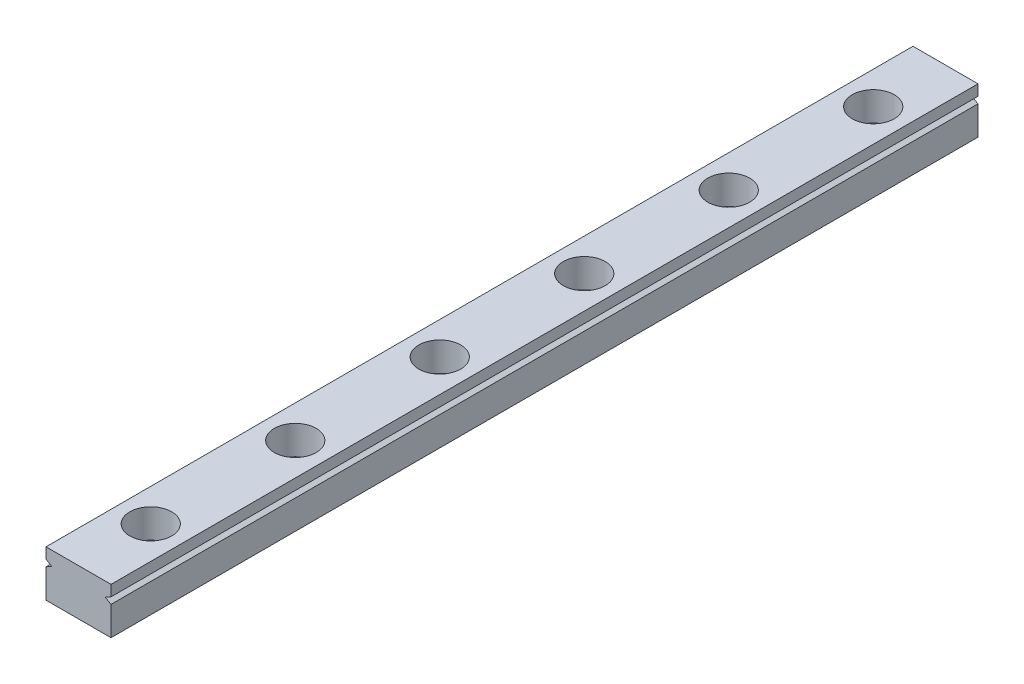
ISO-10303-21;
HEADER;
FILE_DESCRIPTION(('STEP AP214'),'2;1');
FILE_NAME('part.step','',(''),(''),'','','');
FILE_SCHEMA(('AUTOMOTIVE_DESIGN { 1 0 10303 214 1 1 1 1 }'));
ENDSEC;
DATA;
#1=APPLICATION_CONTEXT('core data for automotive mechanical design processes');
#2=APPLICATION_PROTOCOL_DEFINITION('international standard','automotive_design',2000,#1);
#3=PRODUCT_CONTEXT('',#1,'mechanical');
#4=PRODUCT('Part','Part','',(#3));
#5=PRODUCT_RELATED_PRODUCT_CATEGORY('part','',(#4));
#6=PRODUCT_DEFINITION_FORMATION('','',#4);
#7=PRODUCT_DEFINITION_CONTEXT('part definition',#1,'design');
#8=PRODUCT_DEFINITION('design','',#6,#7);
#9=PRODUCT_DEFINITION_SHAPE('','',#8);
#10=(LENGTH_UNIT() NAMED_UNIT(*) SI_UNIT(.MILLI.,.METRE.));
#11=(NAMED_UNIT(*) PLANE_ANGLE_UNIT() SI_UNIT($,.RADIAN.));
#12=(NAMED_UNIT(*) SI_UNIT($,.STERADIAN.) SOLID_ANGLE_UNIT());
#13=UNCERTAINTY_MEASURE_WITH_UNIT(LENGTH_MEASURE(1.E-05),#10,'distance_accuracy_value','');
#14=(GEOMETRIC_REPRESENTATION_CONTEXT(3) GLOBAL_UNCERTAINTY_ASSIGNED_CONTEXT((#13)) GLOBAL_UNIT_ASSIGNED_CONTEXT((#10,
#11,#12)) REPRESENTATION_CONTEXT('',''));
#15=CARTESIAN_POINT('',(0.,0.,0.));
#16=DIRECTION('',(0.,0.,1.));
#17=DIRECTION('',(1.,0.,0.));
#18=AXIS2_PLACEMENT_3D('',#15,#16,#17);
#19=CARTESIAN_POINT('',(0.,4.,120.));
#20=DIRECTION('',(1.,0.,0.));
#21=DIRECTION('',(0.,0.,-1.));
#22=AXIS2_PLACEMENT_3D('',#19,#20,#21);
#23=PLANE('',#22);
#24=DIRECTION('',(0.,-1.,0.));
#25=VECTOR('',#24,1.);
#26=CARTESIAN_POINT('',(0.,4.,0.));
#27=LINE('',#26,#25);
#28=CARTESIAN_POINT('',(0.,4.,0.));
#29=VERTEX_POINT('',#28);
#30=CARTESIAN_POINT('',(0.,0.,0.));
#31=VERTEX_POINT('',#30);
#32=EDGE_CURVE('E141',#29,#31,#27,.T.);
#33=ORIENTED_EDGE('',*,*,#32,.T.);
#34=DIRECTION('',(0.,0.,-1.));
#35=VECTOR('',#34,1.);
#36=CARTESIAN_POINT('',(0.,0.,120.));
#37=LINE('',#36,#35);
#38=CARTESIAN_POINT('',(0.,0.,120.));
#39=VERTEX_POINT('',#38);
#40=EDGE_CURVE('E11',#39,#31,#37,.T.);
#41=ORIENTED_EDGE('',*,*,#40,.F.);
#42=DIRECTION('',(0.,-1.,0.));
#43=VECTOR('',#42,1.);
#44=CARTESIAN_POINT('',(0.,4.,120.));
#45=LINE('',#44,#43);
#46=CARTESIAN_POINT('',(0.,4.,120.));
#47=VERTEX_POINT('',#46);
#48=EDGE_CURVE('E160',#47,#39,#45,.T.);
#49=ORIENTED_EDGE('',*,*,#48,.F.);
#50=DIRECTION('',(0.,0.,-1.));
#51=VECTOR('',#50,1.);
#52=CARTESIAN_POINT('',(0.,4.,120.));
#53=LINE('',#52,#51);
#54=EDGE_CURVE('E137',#47,#29,#53,.T.);
#55=ORIENTED_EDGE('',*,*,#54,.T.);
#56=EDGE_LOOP('',(#33,#41,#49,#55));
#57=FACE_BOUND('',#56,.T.);
#58=ADVANCED_FACE('F33',(#57),#23,.F.);
#59=CARTESIAN_POINT('',(0.,0.,120.));
#60=DIRECTION('',(0.,1.,0.));
#61=DIRECTION('',(0.,0.,1.));
#62=AXIS2_PLACEMENT_3D('',#59,#60,#61);
#63=PLANE('',#62);
#64=CARTESIAN_POINT('',(4.5,0.,110.));
#65=DIRECTION('',(0.,1.,0.));
#66=DIRECTION('',(0.,0.,1.));
#67=AXIS2_PLACEMENT_3D('',#64,#65,#66);
#68=CIRCLE('',#67,1.7);
#69=CARTESIAN_POINT('',(4.5,0.,111.7));
#70=VERTEX_POINT('',#69);
#71=EDGE_CURVE('E211',#70,#70,#68,.T.);
#72=ORIENTED_EDGE('',*,*,#71,.T.);
#73=EDGE_LOOP('',(#72));
#74=FACE_BOUND('',#73,.T.);
#75=CARTESIAN_POINT('',(4.49999999999993,0.,90.));
#76=DIRECTION('',(0.,1.,0.));
#77=DIRECTION('',(0.,0.,1.));
#78=AXIS2_PLACEMENT_3D('',#75,#76,#77);
#79=CIRCLE('',#78,1.7);
#80=CARTESIAN_POINT('',(4.49999999999993,0.,91.7));
#81=VERTEX_POINT('',#80);
#82=EDGE_CURVE('E270',#81,#81,#79,.T.);
#83=ORIENTED_EDGE('',*,*,#82,.T.);
#84=EDGE_LOOP('',(#83));
#85=FACE_BOUND('',#84,.T.);
#86=CARTESIAN_POINT('',(4.49999999999986,0.,70.));
#87=DIRECTION('',(0.,1.,0.));
#88=DIRECTION('',(0.,0.,1.));
#89=AXIS2_PLACEMENT_3D('',#86,#87,#88);
#90=CIRCLE('',#89,1.7);
#91=CARTESIAN_POINT('',(4.49999999999986,0.,71.7));
#92=VERTEX_POINT('',#91);
#93=EDGE_CURVE('E264',#92,#92,#90,.T.);
#94=ORIENTED_EDGE('',*,*,#93,.T.);
#95=EDGE_LOOP('',(#94));
#96=FACE_BOUND('',#95,.T.);
#97=CARTESIAN_POINT('',(4.49999999999979,0.,50.));
#98=DIRECTION('',(0.,1.,0.));
#99=DIRECTION('',(0.,0.,1.));
#100=AXIS2_PLACEMENT_3D('',#97,#98,#99);
#101=CIRCLE('',#100,1.7);
#102=CARTESIAN_POINT('',(4.49999999999979,0.,51.7));
#103=VERTEX_POINT('',#102);
#104=EDGE_CURVE('E258',#103,#103,#101,.T.);
#105=ORIENTED_EDGE('',*,*,#104,.T.);
#106=EDGE_LOOP('',(#105));
#107=FACE_BOUND('',#106,.T.);
#108=CARTESIAN_POINT('',(4.49999999999972,0.,30.));
#109=DIRECTION('',(0.,1.,0.));
#110=DIRECTION('',(0.,0.,1.));
#111=AXIS2_PLACEMENT_3D('',#108,#109,#110);
#112=CIRCLE('',#111,1.7);
#113=CARTESIAN_POINT('',(4.49999999999972,0.,31.7));
#114=VERTEX_POINT('',#113);
#115=EDGE_CURVE('E252',#114,#114,#112,.T.);
#116=ORIENTED_EDGE('',*,*,#115,.T.);
#117=EDGE_LOOP('',(#116));
#118=FACE_BOUND('',#117,.T.);
#119=CARTESIAN_POINT('',(4.49999999999965,0.,9.99999999999999));
#120=DIRECTION('',(0.,1.,0.));
#121=DIRECTION('',(0.,0.,1.));
#122=AXIS2_PLACEMENT_3D('',#119,#120,#121);
#123=CIRCLE('',#122,1.7);
#124=CARTESIAN_POINT('',(4.49999999999965,0.,11.7));
#125=VERTEX_POINT('',#124);
#126=EDGE_CURVE('E246',#125,#125,#123,.T.);
#127=ORIENTED_EDGE('',*,*,#126,.T.);
#128=EDGE_LOOP('',(#127));
#129=FACE_BOUND('',#128,.T.);
#130=DIRECTION('',(1.,0.,0.));
#131=VECTOR('',#130,1.);
#132=CARTESIAN_POINT('',(0.,0.,0.));
#133=LINE('',#132,#131);
#134=CARTESIAN_POINT('',(9.,0.,0.));
#135=VERTEX_POINT('',#134);
#136=EDGE_CURVE('E144',#31,#135,#133,.T.);
#137=ORIENTED_EDGE('',*,*,#136,.T.);
#138=DIRECTION('',(0.,0.,-1.));
#139=VECTOR('',#138,1.);
#140=CARTESIAN_POINT('',(9.,0.,120.));
#141=LINE('',#140,#139);
#142=CARTESIAN_POINT('',(9.,0.,120.));
#143=VERTEX_POINT('',#142);
#144=EDGE_CURVE('E41',#143,#135,#141,.T.);
#145=ORIENTED_EDGE('',*,*,#144,.F.);
#146=DIRECTION('',(1.,0.,0.));
#147=VECTOR('',#146,1.);
#148=CARTESIAN_POINT('',(0.,0.,120.));
#149=LINE('',#148,#147);
#150=EDGE_CURVE('E98',#39,#143,#149,.T.);
#151=ORIENTED_EDGE('',*,*,#150,.F.);
#152=ORIENTED_EDGE('',*,*,#40,.T.);
#153=EDGE_LOOP('',(#137,#145,#151,#152));
#154=FACE_BOUND('',#153,.T.);
#155=ADVANCED_FACE('F279',(#74,#85,#96,#107,#118,#129,#154),#63,.F.);
#156=CARTESIAN_POINT('',(9.,4.,120.));
#157=DIRECTION('',(-1.,0.,0.));
#158=DIRECTION('',(0.,-1.,0.));
#159=AXIS2_PLACEMENT_3D('',#156,#157,#158);
#160=PLANE('',#159);
#161=DIRECTION('',(0.,1.,0.));
#162=VECTOR('',#161,1.);
#163=CARTESIAN_POINT('',(9.,4.,0.));
#164=LINE('',#163,#162);
#165=CARTESIAN_POINT('',(9.,4.,0.));
#166=VERTEX_POINT('',#165);
#167=EDGE_CURVE('E147',#135,#166,#164,.T.);
#168=ORIENTED_EDGE('',*,*,#167,.T.);
#169=DIRECTION('',(0.,0.,-1.));
#170=VECTOR('',#169,1.);
#171=CARTESIAN_POINT('',(9.,4.,120.));
#172=LINE('',#171,#170);
#173=CARTESIAN_POINT('',(9.,4.,120.));
#174=VERTEX_POINT('',#173);
#175=EDGE_CURVE('E173',#174,#166,#172,.T.);
#176=ORIENTED_EDGE('',*,*,#175,.F.);
#177=DIRECTION('',(0.,1.,0.));
#178=VECTOR('',#177,1.);
#179=CARTESIAN_POINT('',(9.,4.,120.));
#180=LINE('',#179,#178);
#181=EDGE_CURVE('E181',#143,#174,#180,.T.);
#182=ORIENTED_EDGE('',*,*,#181,.F.);
#183=ORIENTED_EDGE('',*,*,#144,.T.);
#184=EDGE_LOOP('',(#168,#176,#182,#183));
#185=FACE_BOUND('',#184,.T.);
#186=ADVANCED_FACE('F179',(#185),#160,.F.);
#187=CARTESIAN_POINT('',(8.2,4.45,120.));
#188=DIRECTION('',(-0.490261239632559,-0.871575537124549,0.));
#189=DIRECTION('',(0.87157553712455,-0.490261239632559,0.));
#190=AXIS2_PLACEMENT_3D('',#187,#188,#189);
#191=PLANE('',#190);
#192=DIRECTION('',(-0.871575537124549,0.490261239632559,0.));
#193=VECTOR('',#192,1.);
#194=CARTESIAN_POINT('',(8.2,4.45,0.));
#195=LINE('',#194,#193);
#196=CARTESIAN_POINT('',(8.2,4.45,0.));
#197=VERTEX_POINT('',#196);
#198=EDGE_CURVE('E149',#166,#197,#195,.T.);
#199=ORIENTED_EDGE('',*,*,#198,.T.);
#200=DIRECTION('',(0.,0.,-1.));
#201=VECTOR('',#200,1.);
#202=CARTESIAN_POINT('',(8.2,4.45,120.));
#203=LINE('',#202,#201);
#204=CARTESIAN_POINT('',(8.2,4.45,120.));
#205=VERTEX_POINT('',#204);
#206=EDGE_CURVE('E170',#205,#197,#203,.T.);
#207=ORIENTED_EDGE('',*,*,#206,.F.);
#208=DIRECTION('',(-0.871575537124549,0.490261239632559,0.));
#209=VECTOR('',#208,1.);
#210=CARTESIAN_POINT('',(8.2,4.45,120.));
#211=LINE('',#210,#209);
#212=EDGE_CURVE('E199',#174,#205,#211,.T.);
#213=ORIENTED_EDGE('',*,*,#212,.F.);
#214=ORIENTED_EDGE('',*,*,#175,.T.);
#215=EDGE_LOOP('',(#199,#207,#213,#214));
#216=FACE_BOUND('',#215,.T.);
#217=ADVANCED_FACE('F190',(#216),#191,.F.);
#218=CARTESIAN_POINT('',(9.,4.9,120.));
#219=DIRECTION('',(-0.490261239632559,0.871575537124549,0.));
#220=DIRECTION('',(-0.87157553712455,-0.490261239632559,0.));
#221=AXIS2_PLACEMENT_3D('',#218,#219,#220);
#222=PLANE('',#221);
#223=DIRECTION('',(0.871575537124549,0.490261239632559,0.));
#224=VECTOR('',#223,1.);
#225=CARTESIAN_POINT('',(9.,4.9,0.));
#226=LINE('',#225,#224);
#227=CARTESIAN_POINT('',(9.,4.9,0.));
#228=VERTEX_POINT('',#227);
#229=EDGE_CURVE('E151',#197,#228,#226,.T.);
#230=ORIENTED_EDGE('',*,*,#229,.T.);
#231=DIRECTION('',(0.,0.,-1.));
#232=VECTOR('',#231,1.);
#233=CARTESIAN_POINT('',(9.,4.9,120.));
#234=LINE('',#233,#232);
#235=CARTESIAN_POINT('',(9.,4.9,120.));
#236=VERTEX_POINT('',#235);
#237=EDGE_CURVE('E167',#236,#228,#234,.T.);
#238=ORIENTED_EDGE('',*,*,#237,.F.);
#239=DIRECTION('',(0.871575537124549,0.490261239632559,0.));
#240=VECTOR('',#239,1.);
#241=CARTESIAN_POINT('',(9.,4.9,120.));
#242=LINE('',#241,#240);
#243=EDGE_CURVE('E196',#205,#236,#242,.T.);
#244=ORIENTED_EDGE('',*,*,#243,.F.);
#245=ORIENTED_EDGE('',*,*,#206,.T.);
#246=EDGE_LOOP('',(#230,#238,#244,#245));
#247=FACE_BOUND('',#246,.T.);
#248=ADVANCED_FACE('F194',(#247),#222,.F.);
#249=CARTESIAN_POINT('',(9.,6.4,120.));
#250=DIRECTION('',(-1.,0.,0.));
#251=DIRECTION('',(0.,0.,1.));
#252=AXIS2_PLACEMENT_3D('',#249,#250,#251);
#253=PLANE('',#252);
#254=DIRECTION('',(0.,1.,0.));
#255=VECTOR('',#254,1.);
#256=CARTESIAN_POINT('',(9.,6.4,0.));
#257=LINE('',#256,#255);
#258=CARTESIAN_POINT('',(9.,6.4,0.));
#259=VERTEX_POINT('',#258);
#260=EDGE_CURVE('E153',#228,#259,#257,.T.);
#261=ORIENTED_EDGE('',*,*,#260,.T.);
#262=DIRECTION('',(0.,0.,-1.));
#263=VECTOR('',#262,1.);
#264=CARTESIAN_POINT('',(9.,6.4,120.));
#265=LINE('',#264,#263);
#266=CARTESIAN_POINT('',(9.,6.4,120.));
#267=VERTEX_POINT('',#266);
#268=EDGE_CURVE('E164',#267,#259,#265,.T.);
#269=ORIENTED_EDGE('',*,*,#268,.F.);
#270=DIRECTION('',(0.,1.,0.));
#271=VECTOR('',#270,1.);
#272=CARTESIAN_POINT('',(9.,6.4,120.));
#273=LINE('',#272,#271);
#274=EDGE_CURVE('E198',#236,#267,#273,.T.);
#275=ORIENTED_EDGE('',*,*,#274,.F.);
#276=ORIENTED_EDGE('',*,*,#237,.T.);
#277=EDGE_LOOP('',(#261,#269,#275,#276));
#278=FACE_BOUND('',#277,.T.);
#279=ADVANCED_FACE('F306',(#278),#253,.F.);
#280=CARTESIAN_POINT('',(0.,6.4,120.));
#281=DIRECTION('',(0.,-1.,0.));
#282=DIRECTION('',(0.,0.,-1.));
#283=AXIS2_PLACEMENT_3D('',#280,#281,#282);
#284=PLANE('',#283);
#285=CARTESIAN_POINT('',(4.5,6.4,110.));
#286=DIRECTION('',(0.,1.,0.));
#287=DIRECTION('',(0.,0.,1.));
#288=AXIS2_PLACEMENT_3D('',#285,#286,#287);
#289=CIRCLE('',#288,2.9);
#290=CARTESIAN_POINT('',(4.5,6.4,112.9));
#291=VERTEX_POINT('',#290);
#292=EDGE_CURVE('E238',#291,#291,#289,.T.);
#293=ORIENTED_EDGE('',*,*,#292,.F.);
#294=EDGE_LOOP('',(#293));
#295=FACE_BOUND('',#294,.T.);
#296=CARTESIAN_POINT('',(4.49999999999993,6.4,90.));
#297=DIRECTION('',(0.,1.,0.));
#298=DIRECTION('',(0.,0.,1.));
#299=AXIS2_PLACEMENT_3D('',#296,#297,#298);
#300=CIRCLE('',#299,2.9);
#301=CARTESIAN_POINT('',(4.49999999999993,6.4,92.9));
#302=VERTEX_POINT('',#301);
#303=EDGE_CURVE('E232',#302,#302,#300,.T.);
#304=ORIENTED_EDGE('',*,*,#303,.F.);
#305=EDGE_LOOP('',(#304));
#306=FACE_BOUND('',#305,.T.);
#307=CARTESIAN_POINT('',(4.49999999999986,6.4,70.));
#308=DIRECTION('',(0.,1.,0.));
#309=DIRECTION('',(0.,0.,1.));
#310=AXIS2_PLACEMENT_3D('',#307,#308,#309);
#311=CIRCLE('',#310,2.9);
#312=CARTESIAN_POINT('',(4.49999999999986,6.4,72.9));
#313=VERTEX_POINT('',#312);
#314=EDGE_CURVE('E226',#313,#313,#311,.T.);
#315=ORIENTED_EDGE('',*,*,#314,.F.);
#316=EDGE_LOOP('',(#315));
#317=FACE_BOUND('',#316,.T.);
#318=CARTESIAN_POINT('',(4.49999999999979,6.4,50.));
#319=DIRECTION('',(0.,1.,0.));
#320=DIRECTION('',(0.,0.,1.));
#321=AXIS2_PLACEMENT_3D('',#318,#319,#320);
#322=CIRCLE('',#321,2.9);
#323=CARTESIAN_POINT('',(4.49999999999979,6.4,52.9));
#324=VERTEX_POINT('',#323);
#325=EDGE_CURVE('E220',#324,#324,#322,.T.);
#326=ORIENTED_EDGE('',*,*,#325,.F.);
#327=EDGE_LOOP('',(#326));
#328=FACE_BOUND('',#327,.T.);
#329=CARTESIAN_POINT('',(4.49999999999972,6.4,30.));
#330=DIRECTION('',(0.,1.,0.));
#331=DIRECTION('',(0.,0.,1.));
#332=AXIS2_PLACEMENT_3D('',#329,#330,#331);
#333=CIRCLE('',#332,2.9);
#334=CARTESIAN_POINT('',(4.49999999999972,6.4,32.9));
#335=VERTEX_POINT('',#334);
#336=EDGE_CURVE('E214',#335,#335,#333,.T.);
#337=ORIENTED_EDGE('',*,*,#336,.F.);
#338=EDGE_LOOP('',(#337));
#339=FACE_BOUND('',#338,.T.);
#340=CARTESIAN_POINT('',(4.49999999999965,6.4,10.));
#341=DIRECTION('',(0.,1.,0.));
#342=DIRECTION('',(0.,0.,1.));
#343=AXIS2_PLACEMENT_3D('',#340,#341,#342);
#344=CIRCLE('',#343,2.9);
#345=CARTESIAN_POINT('',(4.49999999999965,6.4,12.9000000000001));
#346=VERTEX_POINT('',#345);
#347=EDGE_CURVE('E207',#346,#346,#344,.T.);
#348=ORIENTED_EDGE('',*,*,#347,.F.);
#349=EDGE_LOOP('',(#348));
#350=FACE_BOUND('',#349,.T.);
#351=DIRECTION('',(-1.,0.,0.));
#352=VECTOR('',#351,1.);
#353=CARTESIAN_POINT('',(0.,6.4,0.));
#354=LINE('',#353,#352);
#355=CARTESIAN_POINT('',(0.,6.4,0.));
#356=VERTEX_POINT('',#355);
#357=EDGE_CURVE('E155',#259,#356,#354,.T.);
#358=ORIENTED_EDGE('',*,*,#357,.T.);
#359=DIRECTION('',(0.,0.,-1.));
#360=VECTOR('',#359,1.);
#361=CARTESIAN_POINT('',(0.,6.4,120.));
#362=LINE('',#361,#360);
#363=CARTESIAN_POINT('',(0.,6.4,120.));
#364=VERTEX_POINT('',#363);
#365=EDGE_CURVE('E132',#364,#356,#362,.T.);
#366=ORIENTED_EDGE('',*,*,#365,.F.);
#367=DIRECTION('',(-1.,0.,0.));
#368=VECTOR('',#367,1.);
#369=CARTESIAN_POINT('',(0.,6.4,120.));
#370=LINE('',#369,#368);
#371=EDGE_CURVE('E123',#267,#364,#370,.T.);
#372=ORIENTED_EDGE('',*,*,#371,.F.);
#373=ORIENTED_EDGE('',*,*,#268,.T.);
#374=EDGE_LOOP('',(#358,#366,#372,#373));
#375=FACE_BOUND('',#374,.T.);
#376=ADVANCED_FACE('F303',(#295,#306,#317,#328,#339,#350,#375),#284,.F.);
#377=CARTESIAN_POINT('',(0.,6.4,120.));
#378=DIRECTION('',(1.,0.,0.));
#379=DIRECTION('',(0.,1.,0.));
#380=AXIS2_PLACEMENT_3D('',#377,#378,#379);
#381=PLANE('',#380);
#382=DIRECTION('',(0.,-1.,0.));
#383=VECTOR('',#382,1.);
#384=CARTESIAN_POINT('',(0.,6.4,0.));
#385=LINE('',#384,#383);
#386=CARTESIAN_POINT('',(0.,4.9,0.));
#387=VERTEX_POINT('',#386);
#388=EDGE_CURVE('E131',#356,#387,#385,.T.);
#389=ORIENTED_EDGE('',*,*,#388,.T.);
#390=DIRECTION('',(0.,0.,-1.));
#391=VECTOR('',#390,1.);
#392=CARTESIAN_POINT('',(0.,4.9,120.));
#393=LINE('',#392,#391);
#394=CARTESIAN_POINT('',(0.,4.9,120.));
#395=VERTEX_POINT('',#394);
#396=EDGE_CURVE('E128',#395,#387,#393,.T.);
#397=ORIENTED_EDGE('',*,*,#396,.F.);
#398=DIRECTION('',(0.,-1.,0.));
#399=VECTOR('',#398,1.);
#400=CARTESIAN_POINT('',(0.,6.4,120.));
#401=LINE('',#400,#399);
#402=EDGE_CURVE('E117',#364,#395,#401,.T.);
#403=ORIENTED_EDGE('',*,*,#402,.F.);
#404=ORIENTED_EDGE('',*,*,#365,.T.);
#405=EDGE_LOOP('',(#389,#397,#403,#404));
#406=FACE_BOUND('',#405,.T.);
#407=ADVANCED_FACE('F129',(#406),#381,.F.);
#408=CARTESIAN_POINT('',(0.,4.9,120.));
#409=DIRECTION('',(0.490261239632558,0.87157553712455,0.));
#410=DIRECTION('',(-0.87157553712455,0.490261239632558,0.));
#411=AXIS2_PLACEMENT_3D('',#408,#409,#410);
#412=PLANE('',#411);
#413=DIRECTION('',(0.87157553712455,-0.490261239632558,0.));
#414=VECTOR('',#413,1.);
#415=CARTESIAN_POINT('',(0.,4.9,0.));
#416=LINE('',#415,#414);
#417=CARTESIAN_POINT('',(0.800000000000001,4.45,0.));
#418=VERTEX_POINT('',#417);
#419=EDGE_CURVE('E84',#387,#418,#416,.T.);
#420=ORIENTED_EDGE('',*,*,#419,.T.);
#421=DIRECTION('',(0.,0.,-1.));
#422=VECTOR('',#421,1.);
#423=CARTESIAN_POINT('',(0.800000000000001,4.45,120.));
#424=LINE('',#423,#422);
#425=CARTESIAN_POINT('',(0.800000000000001,4.45,120.));
#426=VERTEX_POINT('',#425);
#427=EDGE_CURVE('E133',#426,#418,#424,.T.);
#428=ORIENTED_EDGE('',*,*,#427,.F.);
#429=DIRECTION('',(0.87157553712455,-0.490261239632558,0.));
#430=VECTOR('',#429,1.);
#431=CARTESIAN_POINT('',(0.,4.9,120.));
#432=LINE('',#431,#430);
#433=EDGE_CURVE('E121',#395,#426,#432,.T.);
#434=ORIENTED_EDGE('',*,*,#433,.F.);
#435=ORIENTED_EDGE('',*,*,#396,.T.);
#436=EDGE_LOOP('',(#420,#428,#434,#435));
#437=FACE_BOUND('',#436,.T.);
#438=ADVANCED_FACE('F135',(#437),#412,.F.);
#439=CARTESIAN_POINT('',(0.800000000000001,4.45,120.));
#440=DIRECTION('',(0.490261239632558,-0.87157553712455,0.));
#441=DIRECTION('',(0.87157553712455,0.490261239632558,0.));
#442=AXIS2_PLACEMENT_3D('',#439,#440,#441);
#443=PLANE('',#442);
#444=DIRECTION('',(-0.87157553712455,-0.490261239632558,0.));
#445=VECTOR('',#444,1.);
#446=CARTESIAN_POINT('',(0.800000000000001,4.45,0.));
#447=LINE('',#446,#445);
#448=EDGE_CURVE('E90',#418,#29,#447,.T.);
#449=ORIENTED_EDGE('',*,*,#448,.T.);
#450=ORIENTED_EDGE('',*,*,#54,.F.);
#451=DIRECTION('',(-0.87157553712455,-0.490261239632558,0.));
#452=VECTOR('',#451,1.);
#453=CARTESIAN_POINT('',(0.800000000000001,4.45,120.));
#454=LINE('',#453,#452);
#455=EDGE_CURVE('E49',#426,#47,#454,.T.);
#456=ORIENTED_EDGE('',*,*,#455,.F.);
#457=ORIENTED_EDGE('',*,*,#427,.T.);
#458=EDGE_LOOP('',(#449,#450,#456,#457));
#459=FACE_BOUND('',#458,.T.);
#460=ADVANCED_FACE('F323',(#459),#443,.F.);
#461=CARTESIAN_POINT('',(0.,0.,120.));
#462=DIRECTION('',(0.,0.,1.));
#463=DIRECTION('',(1.,0.,0.));
#464=AXIS2_PLACEMENT_3D('',#461,#462,#463);
#465=PLANE('',#464);
#466=ORIENTED_EDGE('',*,*,#48,.T.);
#467=ORIENTED_EDGE('',*,*,#150,.T.);
#468=ORIENTED_EDGE('',*,*,#181,.T.);
#469=ORIENTED_EDGE('',*,*,#212,.T.);
#470=ORIENTED_EDGE('',*,*,#243,.T.);
#471=ORIENTED_EDGE('',*,*,#274,.T.);
#472=ORIENTED_EDGE('',*,*,#371,.T.);
#473=ORIENTED_EDGE('',*,*,#402,.T.);
#474=ORIENTED_EDGE('',*,*,#433,.T.);
#475=ORIENTED_EDGE('',*,*,#455,.T.);
#476=EDGE_LOOP('',(#466,#467,#468,#469,#470,#471,#472,#473,#474,#475));
#477=FACE_BOUND('',#476,.T.);
#478=ADVANCED_FACE('F119',(#477),#465,.T.);
#479=CARTESIAN_POINT('',(0.,0.,0.));
#480=DIRECTION('',(0.,0.,1.));
#481=DIRECTION('',(1.,0.,0.));
#482=AXIS2_PLACEMENT_3D('',#479,#480,#481);
#483=PLANE('',#482);
#484=ORIENTED_EDGE('',*,*,#32,.F.);
#485=ORIENTED_EDGE('',*,*,#448,.F.);
#486=ORIENTED_EDGE('',*,*,#419,.F.);
#487=ORIENTED_EDGE('',*,*,#388,.F.);
#488=ORIENTED_EDGE('',*,*,#357,.F.);
#489=ORIENTED_EDGE('',*,*,#260,.F.);
#490=ORIENTED_EDGE('',*,*,#229,.F.);
#491=ORIENTED_EDGE('',*,*,#198,.F.);
#492=ORIENTED_EDGE('',*,*,#167,.F.);
#493=ORIENTED_EDGE('',*,*,#136,.F.);
#494=EDGE_LOOP('',(#484,#485,#486,#487,#488,#489,#490,#491,#492,#493));
#495=FACE_BOUND('',#494,.T.);
#496=ADVANCED_FACE('F185',(#495),#483,.F.);
#497=CARTESIAN_POINT('',(4.49999999999965,2.4,10.));
#498=DIRECTION('',(0.,1.,0.));
#499=DIRECTION('',(0.,0.,1.));
#500=AXIS2_PLACEMENT_3D('',#497,#498,#499);
#501=CYLINDRICAL_SURFACE('',#500,2.9);
#502=CARTESIAN_POINT('',(4.49999999999965,2.4,10.));
#503=DIRECTION('',(0.,1.,0.));
#504=DIRECTION('',(0.,0.,1.));
#505=AXIS2_PLACEMENT_3D('',#502,#503,#504);
#506=CIRCLE('',#505,2.9);
#507=CARTESIAN_POINT('',(4.49999999999965,2.4,12.9000000000001));
#508=VERTEX_POINT('',#507);
#509=EDGE_CURVE('E210',#508,#508,#506,.T.);
#510=ORIENTED_EDGE('',*,*,#509,.F.);
#511=EDGE_LOOP('',(#510));
#512=FACE_BOUND('',#511,.T.);
#513=ORIENTED_EDGE('',*,*,#347,.T.);
#514=EDGE_LOOP('',(#513));
#515=FACE_BOUND('',#514,.T.);
#516=ADVANCED_FACE('F377',(#512,#515),#501,.F.);
#517=CARTESIAN_POINT('',(4.49999999999965,2.4,10.));
#518=DIRECTION('',(0.,1.,0.));
#519=DIRECTION('',(0.,0.,1.));
#520=AXIS2_PLACEMENT_3D('',#517,#518,#519);
#521=PLANE('',#520);
#522=CARTESIAN_POINT('',(4.49999999999965,2.4,9.99999999999999));
#523=DIRECTION('',(0.,1.,0.));
#524=DIRECTION('',(0.,0.,1.));
#525=AXIS2_PLACEMENT_3D('',#522,#523,#524);
#526=CIRCLE('',#525,1.7);
#527=CARTESIAN_POINT('',(4.49999999999965,2.4,11.7));
#528=VERTEX_POINT('',#527);
#529=EDGE_CURVE('E243',#528,#528,#526,.T.);
#530=ORIENTED_EDGE('',*,*,#529,.F.);
#531=EDGE_LOOP('',(#530));
#532=FACE_BOUND('',#531,.T.);
#533=ORIENTED_EDGE('',*,*,#509,.T.);
#534=EDGE_LOOP('',(#533));
#535=FACE_BOUND('',#534,.T.);
#536=ADVANCED_FACE('F391',(#532,#535),#521,.T.);
#537=CARTESIAN_POINT('',(4.49999999999972,2.4,30.));
#538=DIRECTION('',(0.,1.,0.));
#539=DIRECTION('',(0.,0.,1.));
#540=AXIS2_PLACEMENT_3D('',#537,#538,#539);
#541=CYLINDRICAL_SURFACE('',#540,2.9);
#542=CARTESIAN_POINT('',(4.49999999999972,2.4,30.));
#543=DIRECTION('',(0.,1.,0.));
#544=DIRECTION('',(0.,0.,1.));
#545=AXIS2_PLACEMENT_3D('',#542,#543,#544);
#546=CIRCLE('',#545,2.9);
#547=CARTESIAN_POINT('',(4.49999999999972,2.4,32.9));
#548=VERTEX_POINT('',#547);
#549=EDGE_CURVE('E217',#548,#548,#546,.T.);
#550=ORIENTED_EDGE('',*,*,#549,.F.);
#551=EDGE_LOOP('',(#550));
#552=FACE_BOUND('',#551,.T.);
#553=ORIENTED_EDGE('',*,*,#336,.T.);
#554=EDGE_LOOP('',(#553));
#555=FACE_BOUND('',#554,.T.);
#556=ADVANCED_FACE('F399',(#552,#555),#541,.F.);
#557=CARTESIAN_POINT('',(4.49999999999972,2.4,30.));
#558=DIRECTION('',(0.,1.,0.));
#559=DIRECTION('',(0.,0.,1.));
#560=AXIS2_PLACEMENT_3D('',#557,#558,#559);
#561=PLANE('',#560);
#562=CARTESIAN_POINT('',(4.49999999999972,2.4,30.));
#563=DIRECTION('',(0.,1.,0.));
#564=DIRECTION('',(0.,0.,1.));
#565=AXIS2_PLACEMENT_3D('',#562,#563,#564);
#566=CIRCLE('',#565,1.7);
#567=CARTESIAN_POINT('',(4.49999999999972,2.4,31.7));
#568=VERTEX_POINT('',#567);
#569=EDGE_CURVE('E249',#568,#568,#566,.T.);
#570=ORIENTED_EDGE('',*,*,#569,.F.);
#571=EDGE_LOOP('',(#570));
#572=FACE_BOUND('',#571,.T.);
#573=ORIENTED_EDGE('',*,*,#549,.T.);
#574=EDGE_LOOP('',(#573));
#575=FACE_BOUND('',#574,.T.);
#576=ADVANCED_FACE('F404',(#572,#575),#561,.T.);
#577=CARTESIAN_POINT('',(4.49999999999979,2.4,50.));
#578=DIRECTION('',(0.,1.,0.));
#579=DIRECTION('',(0.,0.,1.));
#580=AXIS2_PLACEMENT_3D('',#577,#578,#579);
#581=CYLINDRICAL_SURFACE('',#580,2.9);
#582=CARTESIAN_POINT('',(4.49999999999979,2.4,50.));
#583=DIRECTION('',(0.,1.,0.));
#584=DIRECTION('',(0.,0.,1.));
#585=AXIS2_PLACEMENT_3D('',#582,#583,#584);
#586=CIRCLE('',#585,2.9);
#587=CARTESIAN_POINT('',(4.49999999999979,2.4,52.9));
#588=VERTEX_POINT('',#587);
#589=EDGE_CURVE('E223',#588,#588,#586,.T.);
#590=ORIENTED_EDGE('',*,*,#589,.F.);
#591=EDGE_LOOP('',(#590));
#592=FACE_BOUND('',#591,.T.);
#593=ORIENTED_EDGE('',*,*,#325,.T.);
#594=EDGE_LOOP('',(#593));
#595=FACE_BOUND('',#594,.T.);
#596=ADVANCED_FACE('F412',(#592,#595),#581,.F.);
#597=CARTESIAN_POINT('',(4.49999999999979,2.4,50.));
#598=DIRECTION('',(0.,1.,0.));
#599=DIRECTION('',(0.,0.,1.));
#600=AXIS2_PLACEMENT_3D('',#597,#598,#599);
#601=PLANE('',#600);
#602=CARTESIAN_POINT('',(4.49999999999979,2.4,50.));
#603=DIRECTION('',(0.,1.,0.));
#604=DIRECTION('',(0.,0.,1.));
#605=AXIS2_PLACEMENT_3D('',#602,#603,#604);
#606=CIRCLE('',#605,1.7);
#607=CARTESIAN_POINT('',(4.49999999999979,2.4,51.7));
#608=VERTEX_POINT('',#607);
#609=EDGE_CURVE('E255',#608,#608,#606,.T.);
#610=ORIENTED_EDGE('',*,*,#609,.F.);
#611=EDGE_LOOP('',(#610));
#612=FACE_BOUND('',#611,.T.);
#613=ORIENTED_EDGE('',*,*,#589,.T.);
#614=EDGE_LOOP('',(#613));
#615=FACE_BOUND('',#614,.T.);
#616=ADVANCED_FACE('F417',(#612,#615),#601,.T.);
#617=CARTESIAN_POINT('',(4.49999999999986,2.4,70.));
#618=DIRECTION('',(0.,1.,0.));
#619=DIRECTION('',(0.,0.,1.));
#620=AXIS2_PLACEMENT_3D('',#617,#618,#619);
#621=CYLINDRICAL_SURFACE('',#620,2.9);
#622=CARTESIAN_POINT('',(4.49999999999986,2.4,70.));
#623=DIRECTION('',(0.,1.,0.));
#624=DIRECTION('',(0.,0.,1.));
#625=AXIS2_PLACEMENT_3D('',#622,#623,#624);
#626=CIRCLE('',#625,2.9);
#627=CARTESIAN_POINT('',(4.49999999999986,2.4,72.9));
#628=VERTEX_POINT('',#627);
#629=EDGE_CURVE('E229',#628,#628,#626,.T.);
#630=ORIENTED_EDGE('',*,*,#629,.F.);
#631=EDGE_LOOP('',(#630));
#632=FACE_BOUND('',#631,.T.);
#633=ORIENTED_EDGE('',*,*,#314,.T.);
#634=EDGE_LOOP('',(#633));
#635=FACE_BOUND('',#634,.T.);
#636=ADVANCED_FACE('F425',(#632,#635),#621,.F.);
#637=CARTESIAN_POINT('',(4.49999999999986,2.4,70.));
#638=DIRECTION('',(0.,1.,0.));
#639=DIRECTION('',(0.,0.,1.));
#640=AXIS2_PLACEMENT_3D('',#637,#638,#639);
#641=PLANE('',#640);
#642=CARTESIAN_POINT('',(4.49999999999986,2.4,70.));
#643=DIRECTION('',(0.,1.,0.));
#644=DIRECTION('',(0.,0.,1.));
#645=AXIS2_PLACEMENT_3D('',#642,#643,#644);
#646=CIRCLE('',#645,1.7);
#647=CARTESIAN_POINT('',(4.49999999999986,2.4,71.7));
#648=VERTEX_POINT('',#647);
#649=EDGE_CURVE('E261',#648,#648,#646,.T.);
#650=ORIENTED_EDGE('',*,*,#649,.F.);
#651=EDGE_LOOP('',(#650));
#652=FACE_BOUND('',#651,.T.);
#653=ORIENTED_EDGE('',*,*,#629,.T.);
#654=EDGE_LOOP('',(#653));
#655=FACE_BOUND('',#654,.T.);
#656=ADVANCED_FACE('F430',(#652,#655),#641,.T.);
#657=CARTESIAN_POINT('',(4.49999999999993,2.4,90.));
#658=DIRECTION('',(0.,1.,0.));
#659=DIRECTION('',(0.,0.,1.));
#660=AXIS2_PLACEMENT_3D('',#657,#658,#659);
#661=CYLINDRICAL_SURFACE('',#660,2.9);
#662=CARTESIAN_POINT('',(4.49999999999993,2.4,90.));
#663=DIRECTION('',(0.,1.,0.));
#664=DIRECTION('',(0.,0.,1.));
#665=AXIS2_PLACEMENT_3D('',#662,#663,#664);
#666=CIRCLE('',#665,2.9);
#667=CARTESIAN_POINT('',(4.49999999999993,2.4,92.9));
#668=VERTEX_POINT('',#667);
#669=EDGE_CURVE('E235',#668,#668,#666,.T.);
#670=ORIENTED_EDGE('',*,*,#669,.F.);
#671=EDGE_LOOP('',(#670));
#672=FACE_BOUND('',#671,.T.);
#673=ORIENTED_EDGE('',*,*,#303,.T.);
#674=EDGE_LOOP('',(#673));
#675=FACE_BOUND('',#674,.T.);
#676=ADVANCED_FACE('F438',(#672,#675),#661,.F.);
#677=CARTESIAN_POINT('',(4.49999999999993,2.4,90.));
#678=DIRECTION('',(0.,1.,0.));
#679=DIRECTION('',(0.,0.,1.));
#680=AXIS2_PLACEMENT_3D('',#677,#678,#679);
#681=PLANE('',#680);
#682=CARTESIAN_POINT('',(4.49999999999993,2.4,90.));
#683=DIRECTION('',(0.,1.,0.));
#684=DIRECTION('',(0.,0.,1.));
#685=AXIS2_PLACEMENT_3D('',#682,#683,#684);
#686=CIRCLE('',#685,1.7);
#687=CARTESIAN_POINT('',(4.49999999999993,2.4,91.7));
#688=VERTEX_POINT('',#687);
#689=EDGE_CURVE('E267',#688,#688,#686,.T.);
#690=ORIENTED_EDGE('',*,*,#689,.F.);
#691=EDGE_LOOP('',(#690));
#692=FACE_BOUND('',#691,.T.);
#693=ORIENTED_EDGE('',*,*,#669,.T.);
#694=EDGE_LOOP('',(#693));
#695=FACE_BOUND('',#694,.T.);
#696=ADVANCED_FACE('F299',(#692,#695),#681,.T.);
#697=CARTESIAN_POINT('',(4.5,2.4,110.));
#698=DIRECTION('',(0.,1.,0.));
#699=DIRECTION('',(0.,0.,1.));
#700=AXIS2_PLACEMENT_3D('',#697,#698,#699);
#701=CYLINDRICAL_SURFACE('',#700,2.9);
#702=CARTESIAN_POINT('',(4.5,2.4,110.));
#703=DIRECTION('',(0.,1.,0.));
#704=DIRECTION('',(0.,0.,1.));
#705=AXIS2_PLACEMENT_3D('',#702,#703,#704);
#706=CIRCLE('',#705,2.9);
#707=CARTESIAN_POINT('',(4.5,2.4,112.9));
#708=VERTEX_POINT('',#707);
#709=EDGE_CURVE('E145',#708,#708,#706,.T.);
#710=ORIENTED_EDGE('',*,*,#709,.F.);
#711=EDGE_LOOP('',(#710));
#712=FACE_BOUND('',#711,.T.);
#713=ORIENTED_EDGE('',*,*,#292,.T.);
#714=EDGE_LOOP('',(#713));
#715=FACE_BOUND('',#714,.T.);
#716=ADVANCED_FACE('F293',(#712,#715),#701,.F.);
#717=CARTESIAN_POINT('',(4.5,2.4,110.));
#718=DIRECTION('',(0.,1.,0.));
#719=DIRECTION('',(0.,0.,1.));
#720=AXIS2_PLACEMENT_3D('',#717,#718,#719);
#721=PLANE('',#720);
#722=CARTESIAN_POINT('',(4.5,2.4,110.));
#723=DIRECTION('',(0.,1.,0.));
#724=DIRECTION('',(0.,0.,1.));
#725=AXIS2_PLACEMENT_3D('',#722,#723,#724);
#726=CIRCLE('',#725,1.7);
#727=CARTESIAN_POINT('',(4.5,2.4,111.7));
#728=VERTEX_POINT('',#727);
#729=EDGE_CURVE('E273',#728,#728,#726,.T.);
#730=ORIENTED_EDGE('',*,*,#729,.F.);
#731=EDGE_LOOP('',(#730));
#732=FACE_BOUND('',#731,.T.);
#733=ORIENTED_EDGE('',*,*,#709,.T.);
#734=EDGE_LOOP('',(#733));
#735=FACE_BOUND('',#734,.T.);
#736=ADVANCED_FACE('F289',(#732,#735),#721,.T.);
#737=CARTESIAN_POINT('',(4.49999999999965,0.,9.99999999999999));
#738=DIRECTION('',(0.,1.,0.));
#739=DIRECTION('',(0.,0.,1.));
#740=AXIS2_PLACEMENT_3D('',#737,#738,#739);
#741=CYLINDRICAL_SURFACE('',#740,1.7);
#742=ORIENTED_EDGE('',*,*,#126,.F.);
#743=EDGE_LOOP('',(#742));
#744=FACE_BOUND('',#743,.T.);
#745=ORIENTED_EDGE('',*,*,#529,.T.);
#746=EDGE_LOOP('',(#745));
#747=FACE_BOUND('',#746,.T.);
#748=ADVANCED_FACE('F292',(#744,#747),#741,.F.);
#749=CARTESIAN_POINT('',(4.49999999999972,0.,30.));
#750=DIRECTION('',(0.,1.,0.));
#751=DIRECTION('',(0.,0.,1.));
#752=AXIS2_PLACEMENT_3D('',#749,#750,#751);
#753=CYLINDRICAL_SURFACE('',#752,1.7);
#754=ORIENTED_EDGE('',*,*,#115,.F.);
#755=EDGE_LOOP('',(#754));
#756=FACE_BOUND('',#755,.T.);
#757=ORIENTED_EDGE('',*,*,#569,.T.);
#758=EDGE_LOOP('',(#757));
#759=FACE_BOUND('',#758,.T.);
#760=ADVANCED_FACE('F507',(#756,#759),#753,.F.);
#761=CARTESIAN_POINT('',(4.49999999999979,0.,50.));
#762=DIRECTION('',(0.,1.,0.));
#763=DIRECTION('',(0.,0.,1.));
#764=AXIS2_PLACEMENT_3D('',#761,#762,#763);
#765=CYLINDRICAL_SURFACE('',#764,1.7);
#766=ORIENTED_EDGE('',*,*,#104,.F.);
#767=EDGE_LOOP('',(#766));
#768=FACE_BOUND('',#767,.T.);
#769=ORIENTED_EDGE('',*,*,#609,.T.);
#770=EDGE_LOOP('',(#769));
#771=FACE_BOUND('',#770,.T.);
#772=ADVANCED_FACE('F517',(#768,#771),#765,.F.);
#773=CARTESIAN_POINT('',(4.49999999999986,0.,70.));
#774=DIRECTION('',(0.,1.,0.));
#775=DIRECTION('',(0.,0.,1.));
#776=AXIS2_PLACEMENT_3D('',#773,#774,#775);
#777=CYLINDRICAL_SURFACE('',#776,1.7);
#778=ORIENTED_EDGE('',*,*,#93,.F.);
#779=EDGE_LOOP('',(#778));
#780=FACE_BOUND('',#779,.T.);
#781=ORIENTED_EDGE('',*,*,#649,.T.);
#782=EDGE_LOOP('',(#781));
#783=FACE_BOUND('',#782,.T.);
#784=ADVANCED_FACE('F527',(#780,#783),#777,.F.);
#785=CARTESIAN_POINT('',(4.49999999999993,0.,90.));
#786=DIRECTION('',(0.,1.,0.));
#787=DIRECTION('',(0.,0.,1.));
#788=AXIS2_PLACEMENT_3D('',#785,#786,#787);
#789=CYLINDRICAL_SURFACE('',#788,1.7);
#790=ORIENTED_EDGE('',*,*,#82,.F.);
#791=EDGE_LOOP('',(#790));
#792=FACE_BOUND('',#791,.T.);
#793=ORIENTED_EDGE('',*,*,#689,.T.);
#794=EDGE_LOOP('',(#793));
#795=FACE_BOUND('',#794,.T.);
#796=ADVANCED_FACE('F285',(#792,#795),#789,.F.);
#797=CARTESIAN_POINT('',(4.5,0.,110.));
#798=DIRECTION('',(0.,1.,0.));
#799=DIRECTION('',(0.,0.,1.));
#800=AXIS2_PLACEMENT_3D('',#797,#798,#799);
#801=CYLINDRICAL_SURFACE('',#800,1.7);
#802=ORIENTED_EDGE('',*,*,#71,.F.);
#803=EDGE_LOOP('',(#802));
#804=FACE_BOUND('',#803,.T.);
#805=ORIENTED_EDGE('',*,*,#729,.T.);
#806=EDGE_LOOP('',(#805));
#807=FACE_BOUND('',#806,.T.);
#808=ADVANCED_FACE('F282',(#804,#807),#801,.F.);
#809=CLOSED_SHELL('',(#58,#155,#186,#217,#248,#279,#376,#407,#438,#460,#478,#496,#516,#536,#556,
#576,#596,#616,#636,#656,#676,#696,#716,#736,#748,#760,#772,#784,#796,#808));
#810=MANIFOLD_SOLID_BREP('B2',#809);
#811=ADVANCED_BREP_SHAPE_REPRESENTATION('',(#18,#810),#14);
#812=SHAPE_DEFINITION_REPRESENTATION(#9,#811);
ENDSEC;
END-ISO-10303-21;
